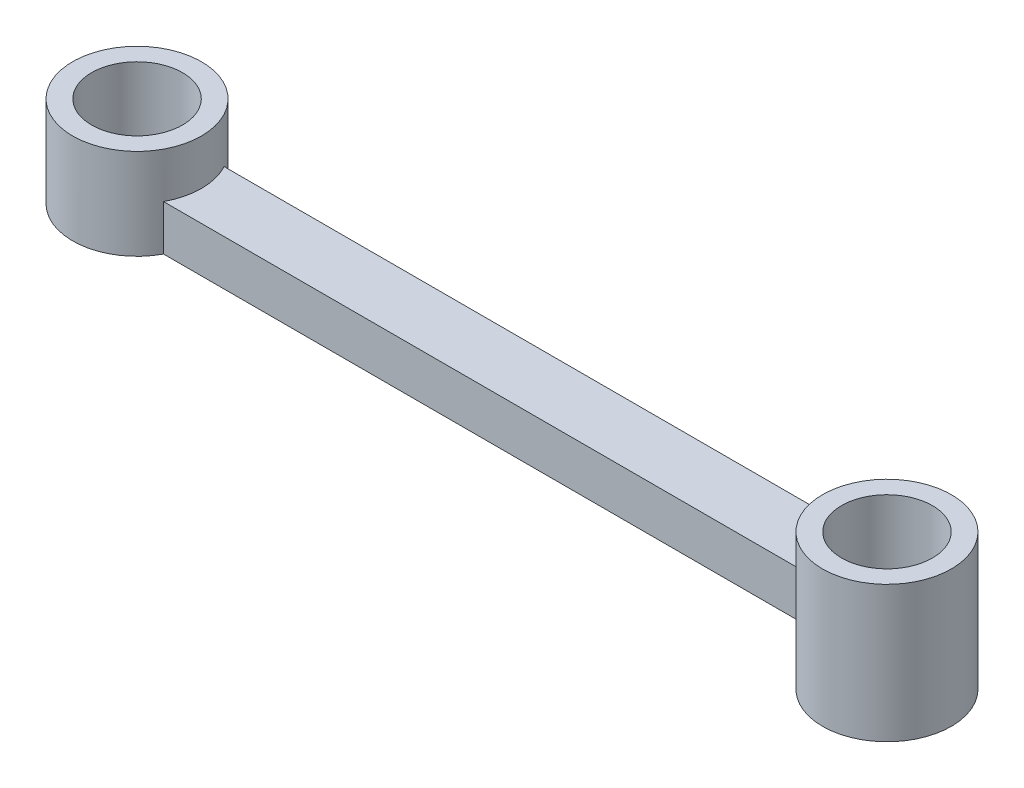
ISO-10303-21;
HEADER;
FILE_DESCRIPTION(('STEP AP214'),'2;1');
FILE_NAME('part.step','',(''),(''),'','','');
FILE_SCHEMA(('AUTOMOTIVE_DESIGN { 1 0 10303 214 1 1 1 1 }'));
ENDSEC;
DATA;
#1=APPLICATION_CONTEXT('core data for automotive mechanical design processes');
#2=APPLICATION_PROTOCOL_DEFINITION('international standard','automotive_design',2000,#1);
#3=PRODUCT_CONTEXT('',#1,'mechanical');
#4=PRODUCT('Part','Part','',(#3));
#5=PRODUCT_RELATED_PRODUCT_CATEGORY('part','',(#4));
#6=PRODUCT_DEFINITION_FORMATION('','',#4);
#7=PRODUCT_DEFINITION_CONTEXT('part definition',#1,'design');
#8=PRODUCT_DEFINITION('design','',#6,#7);
#9=PRODUCT_DEFINITION_SHAPE('','',#8);
#10=(LENGTH_UNIT() NAMED_UNIT(*) SI_UNIT(.MILLI.,.METRE.));
#11=(NAMED_UNIT(*) PLANE_ANGLE_UNIT() SI_UNIT($,.RADIAN.));
#12=(NAMED_UNIT(*) SI_UNIT($,.STERADIAN.) SOLID_ANGLE_UNIT());
#13=UNCERTAINTY_MEASURE_WITH_UNIT(LENGTH_MEASURE(1.E-05),#10,'distance_accuracy_value','');
#14=(GEOMETRIC_REPRESENTATION_CONTEXT(3) GLOBAL_UNCERTAINTY_ASSIGNED_CONTEXT((#13)) GLOBAL_UNIT_ASSIGNED_CONTEXT((#10,
#11,#12)) REPRESENTATION_CONTEXT('',''));
#15=CARTESIAN_POINT('',(0.,0.,0.));
#16=DIRECTION('',(0.,0.,1.));
#17=DIRECTION('',(1.,0.,0.));
#18=AXIS2_PLACEMENT_3D('',#15,#16,#17);
#19=CARTESIAN_POINT('',(0.,3.,1.99999999999999));
#20=DIRECTION('',(0.,0.,1.));
#21=DIRECTION('',(1.,0.,0.));
#22=AXIS2_PLACEMENT_3D('',#19,#20,#21);
#23=PLANE('',#22);
#24=DIRECTION('',(-1.,0.,0.));
#25=VECTOR('',#24,1.);
#26=CARTESIAN_POINT('',(0.,0.,1.99999999999999));
#27=LINE('',#26,#25);
#28=CARTESIAN_POINT('',(21.,0.,1.99999999999999));
#29=VERTEX_POINT('',#28);
#30=CARTESIAN_POINT('',(-21.,0.,2.));
#31=VERTEX_POINT('',#30);
#32=EDGE_CURVE('E98',#29,#31,#27,.T.);
#33=ORIENTED_EDGE('',*,*,#32,.F.);
#34=DIRECTION('',(0.,-1.,0.));
#35=VECTOR('',#34,1.);
#36=CARTESIAN_POINT('',(21.,3.,1.99999999999999));
#37=LINE('',#36,#35);
#38=CARTESIAN_POINT('',(21.,3.,1.99999999999999));
#39=VERTEX_POINT('',#38);
#40=EDGE_CURVE('E11',#39,#29,#37,.T.);
#41=ORIENTED_EDGE('',*,*,#40,.F.);
#42=DIRECTION('',(-1.,0.,0.));
#43=VECTOR('',#42,1.);
#44=CARTESIAN_POINT('',(0.,3.,1.99999999999999));
#45=LINE('',#44,#43);
#46=CARTESIAN_POINT('',(-21.,3.,1.99999999999999));
#47=VERTEX_POINT('',#46);
#48=EDGE_CURVE('E89',#39,#47,#45,.T.);
#49=ORIENTED_EDGE('',*,*,#48,.T.);
#50=DIRECTION('',(0.,-1.,0.));
#51=VECTOR('',#50,1.);
#52=CARTESIAN_POINT('',(-21.,3.,1.99999999999999));
#53=LINE('',#52,#51);
#54=EDGE_CURVE('E73',#47,#31,#53,.T.);
#55=ORIENTED_EDGE('',*,*,#54,.T.);
#56=EDGE_LOOP('',(#33,#41,#49,#55));
#57=FACE_BOUND('',#56,.T.);
#58=ADVANCED_FACE('F36',(#57),#23,.T.);
#59=CARTESIAN_POINT('',(0.,3.,-1.99999999999999));
#60=DIRECTION('',(0.,0.,1.));
#61=DIRECTION('',(1.,0.,0.));
#62=AXIS2_PLACEMENT_3D('',#59,#60,#61);
#63=PLANE('',#62);
#64=DIRECTION('',(-1.,0.,0.));
#65=VECTOR('',#64,1.);
#66=CARTESIAN_POINT('',(0.,0.,-1.99999999999999));
#67=LINE('',#66,#65);
#68=CARTESIAN_POINT('',(21.,0.,-1.99999999999999));
#69=VERTEX_POINT('',#68);
#70=CARTESIAN_POINT('',(-21.,0.,-1.99999999999999));
#71=VERTEX_POINT('',#70);
#72=EDGE_CURVE('E81',#69,#71,#67,.T.);
#73=ORIENTED_EDGE('',*,*,#72,.T.);
#74=DIRECTION('',(0.,-1.,0.));
#75=VECTOR('',#74,1.);
#76=CARTESIAN_POINT('',(-21.,3.,-1.99999999999999));
#77=LINE('',#76,#75);
#78=CARTESIAN_POINT('',(-21.,3.,-1.99999999999999));
#79=VERTEX_POINT('',#78);
#80=EDGE_CURVE('E95',#79,#71,#77,.T.);
#81=ORIENTED_EDGE('',*,*,#80,.F.);
#82=DIRECTION('',(-1.,0.,0.));
#83=VECTOR('',#82,1.);
#84=CARTESIAN_POINT('',(0.,3.,-1.99999999999999));
#85=LINE('',#84,#83);
#86=CARTESIAN_POINT('',(21.,3.,-1.99999999999999));
#87=VERTEX_POINT('',#86);
#88=EDGE_CURVE('E93',#87,#79,#85,.T.);
#89=ORIENTED_EDGE('',*,*,#88,.F.);
#90=DIRECTION('',(0.,-1.,0.));
#91=VECTOR('',#90,1.);
#92=CARTESIAN_POINT('',(21.,3.,-1.99999999999999));
#93=LINE('',#92,#91);
#94=EDGE_CURVE('E44',#87,#69,#93,.T.);
#95=ORIENTED_EDGE('',*,*,#94,.T.);
#96=EDGE_LOOP('',(#73,#81,#89,#95));
#97=FACE_BOUND('',#96,.T.);
#98=ADVANCED_FACE('F92',(#97),#63,.F.);
#99=CARTESIAN_POINT('',(0.,3.,0.));
#100=DIRECTION('',(0.,1.,0.));
#101=DIRECTION('',(0.,0.,1.));
#102=AXIS2_PLACEMENT_3D('',#99,#100,#101);
#103=PLANE('',#102);
#104=ORIENTED_EDGE('',*,*,#48,.F.);
#105=CARTESIAN_POINT('',(24.75,3.,0.));
#106=DIRECTION('',(0.,1.,0.));
#107=DIRECTION('',(0.,0.,1.));
#108=AXIS2_PLACEMENT_3D('',#105,#106,#107);
#109=CIRCLE('',#108,4.25);
#110=EDGE_CURVE('E52',#39,#87,#109,.F.);
#111=ORIENTED_EDGE('',*,*,#110,.T.);
#112=ORIENTED_EDGE('',*,*,#88,.T.);
#113=CARTESIAN_POINT('',(-24.75,3.,0.));
#114=DIRECTION('',(0.,1.,0.));
#115=DIRECTION('',(0.,0.,1.));
#116=AXIS2_PLACEMENT_3D('',#113,#114,#115);
#117=CIRCLE('',#116,4.25);
#118=EDGE_CURVE('E105',#47,#79,#117,.T.);
#119=ORIENTED_EDGE('',*,*,#118,.F.);
#120=EDGE_LOOP('',(#104,#111,#112,#119));
#121=FACE_BOUND('',#120,.T.);
#122=ADVANCED_FACE('F109',(#121),#103,.T.);
#123=CARTESIAN_POINT('',(0.,0.,0.));
#124=DIRECTION('',(0.,1.,0.));
#125=DIRECTION('',(0.,0.,1.));
#126=AXIS2_PLACEMENT_3D('',#123,#124,#125);
#127=PLANE('',#126);
#128=ORIENTED_EDGE('',*,*,#32,.T.);
#129=CARTESIAN_POINT('',(-24.75,0.,0.));
#130=DIRECTION('',(0.,1.,0.));
#131=DIRECTION('',(0.,0.,1.));
#132=AXIS2_PLACEMENT_3D('',#129,#130,#131);
#133=CIRCLE('',#132,4.25);
#134=EDGE_CURVE('E85',#71,#31,#133,.T.);
#135=ORIENTED_EDGE('',*,*,#134,.F.);
#136=ORIENTED_EDGE('',*,*,#72,.F.);
#137=CARTESIAN_POINT('',(24.75,0.,0.));
#138=DIRECTION('',(0.,1.,0.));
#139=DIRECTION('',(0.,0.,1.));
#140=AXIS2_PLACEMENT_3D('',#137,#138,#139);
#141=CIRCLE('',#140,4.25);
#142=EDGE_CURVE('E64',#29,#69,#141,.F.);
#143=ORIENTED_EDGE('',*,*,#142,.F.);
#144=EDGE_LOOP('',(#128,#135,#136,#143));
#145=FACE_BOUND('',#144,.T.);
#146=CARTESIAN_POINT('',(-24.75,0.,0.));
#147=DIRECTION('',(0.,1.,0.));
#148=DIRECTION('',(0.,0.,1.));
#149=AXIS2_PLACEMENT_3D('',#146,#147,#148);
#150=CIRCLE('',#149,3.);
#151=CARTESIAN_POINT('',(-24.75,0.,3.));
#152=VERTEX_POINT('',#151);
#153=EDGE_CURVE('E116',#152,#152,#150,.T.);
#154=ORIENTED_EDGE('',*,*,#153,.T.);
#155=EDGE_LOOP('',(#154));
#156=FACE_BOUND('',#155,.T.);
#157=ADVANCED_FACE('F83',(#145,#156),#127,.F.);
#158=CARTESIAN_POINT('',(-24.75,6.,0.));
#159=DIRECTION('',(0.,-1.,0.));
#160=DIRECTION('',(0.,0.,-1.));
#161=AXIS2_PLACEMENT_3D('',#158,#159,#160);
#162=CYLINDRICAL_SURFACE('',#161,3.);
#163=CARTESIAN_POINT('',(-24.75,6.,0.));
#164=DIRECTION('',(0.,1.,0.));
#165=DIRECTION('',(0.,0.,1.));
#166=AXIS2_PLACEMENT_3D('',#163,#164,#165);
#167=CIRCLE('',#166,3.);
#168=CARTESIAN_POINT('',(-24.75,6.,3.));
#169=VERTEX_POINT('',#168);
#170=EDGE_CURVE('E115',#169,#169,#167,.T.);
#171=ORIENTED_EDGE('',*,*,#170,.T.);
#172=EDGE_LOOP('',(#171));
#173=FACE_BOUND('',#172,.T.);
#174=ORIENTED_EDGE('',*,*,#153,.F.);
#175=EDGE_LOOP('',(#174));
#176=FACE_BOUND('',#175,.T.);
#177=ADVANCED_FACE('F167',(#173,#176),#162,.F.);
#178=CARTESIAN_POINT('',(-24.75,6.,0.));
#179=DIRECTION('',(0.,-1.,0.));
#180=DIRECTION('',(0.,0.,-1.));
#181=AXIS2_PLACEMENT_3D('',#178,#179,#180);
#182=CYLINDRICAL_SURFACE('',#181,4.25);
#183=ORIENTED_EDGE('',*,*,#54,.F.);
#184=ORIENTED_EDGE('',*,*,#118,.T.);
#185=ORIENTED_EDGE('',*,*,#80,.T.);
#186=ORIENTED_EDGE('',*,*,#134,.T.);
#187=EDGE_LOOP('',(#183,#184,#185,#186));
#188=FACE_BOUND('',#187,.T.);
#189=CARTESIAN_POINT('',(-24.75,6.,0.));
#190=DIRECTION('',(0.,1.,0.));
#191=DIRECTION('',(0.,0.,1.));
#192=AXIS2_PLACEMENT_3D('',#189,#190,#191);
#193=CIRCLE('',#192,4.25);
#194=CARTESIAN_POINT('',(-24.75,6.,4.25));
#195=VERTEX_POINT('',#194);
#196=EDGE_CURVE('E100',#195,#195,#193,.T.);
#197=ORIENTED_EDGE('',*,*,#196,.F.);
#198=EDGE_LOOP('',(#197));
#199=FACE_BOUND('',#198,.T.);
#200=ADVANCED_FACE('F106',(#188,#199),#182,.T.);
#201=CARTESIAN_POINT('',(0.,6.,0.));
#202=DIRECTION('',(0.,1.,0.));
#203=DIRECTION('',(0.,0.,1.));
#204=AXIS2_PLACEMENT_3D('',#201,#202,#203);
#205=PLANE('',#204);
#206=ORIENTED_EDGE('',*,*,#170,.F.);
#207=EDGE_LOOP('',(#206));
#208=FACE_BOUND('',#207,.T.);
#209=ORIENTED_EDGE('',*,*,#196,.T.);
#210=EDGE_LOOP('',(#209));
#211=FACE_BOUND('',#210,.T.);
#212=ADVANCED_FACE('F154',(#208,#211),#205,.T.);
#213=CARTESIAN_POINT('',(24.75,-3.,0.));
#214=DIRECTION('',(0.,1.,0.));
#215=DIRECTION('',(0.,0.,1.));
#216=AXIS2_PLACEMENT_3D('',#213,#214,#215);
#217=CYLINDRICAL_SURFACE('',#216,4.25);
#218=ORIENTED_EDGE('',*,*,#110,.F.);
#219=ORIENTED_EDGE('',*,*,#40,.T.);
#220=ORIENTED_EDGE('',*,*,#142,.T.);
#221=ORIENTED_EDGE('',*,*,#94,.F.);
#222=EDGE_LOOP('',(#218,#219,#220,#221));
#223=FACE_BOUND('',#222,.T.);
#224=CARTESIAN_POINT('',(24.75,-3.,0.));
#225=DIRECTION('',(0.,1.,0.));
#226=DIRECTION('',(0.,0.,1.));
#227=AXIS2_PLACEMENT_3D('',#224,#225,#226);
#228=CIRCLE('',#227,4.25);
#229=CARTESIAN_POINT('',(24.75,-3.,4.24999999999999));
#230=VERTEX_POINT('',#229);
#231=EDGE_CURVE('E126',#230,#230,#228,.F.);
#232=ORIENTED_EDGE('',*,*,#231,.F.);
#233=EDGE_LOOP('',(#232));
#234=FACE_BOUND('',#233,.T.);
#235=CARTESIAN_POINT('',(24.75,6.,0.));
#236=DIRECTION('',(0.,1.,0.));
#237=DIRECTION('',(0.,0.,1.));
#238=AXIS2_PLACEMENT_3D('',#235,#236,#237);
#239=CIRCLE('',#238,4.25);
#240=CARTESIAN_POINT('',(24.75,6.,4.24999999999999));
#241=VERTEX_POINT('',#240);
#242=EDGE_CURVE('E132',#241,#241,#239,.F.);
#243=ORIENTED_EDGE('',*,*,#242,.T.);
#244=EDGE_LOOP('',(#243));
#245=FACE_BOUND('',#244,.T.);
#246=ADVANCED_FACE('F96',(#223,#234,#245),#217,.T.);
#247=CARTESIAN_POINT('',(24.75,-3.,0.));
#248=DIRECTION('',(0.,1.,0.));
#249=DIRECTION('',(0.,0.,1.));
#250=AXIS2_PLACEMENT_3D('',#247,#248,#249);
#251=CYLINDRICAL_SURFACE('',#250,3.);
#252=CARTESIAN_POINT('',(24.75,-3.,0.));
#253=DIRECTION('',(0.,1.,0.));
#254=DIRECTION('',(0.,0.,1.));
#255=AXIS2_PLACEMENT_3D('',#252,#253,#254);
#256=CIRCLE('',#255,3.);
#257=CARTESIAN_POINT('',(24.75,-3.,3.));
#258=VERTEX_POINT('',#257);
#259=EDGE_CURVE('E119',#258,#258,#256,.F.);
#260=ORIENTED_EDGE('',*,*,#259,.T.);
#261=EDGE_LOOP('',(#260));
#262=FACE_BOUND('',#261,.T.);
#263=CARTESIAN_POINT('',(24.75,6.,0.));
#264=DIRECTION('',(0.,1.,0.));
#265=DIRECTION('',(0.,0.,1.));
#266=AXIS2_PLACEMENT_3D('',#263,#264,#265);
#267=CIRCLE('',#266,3.);
#268=CARTESIAN_POINT('',(24.75,6.,3.));
#269=VERTEX_POINT('',#268);
#270=EDGE_CURVE('E129',#269,#269,#267,.F.);
#271=ORIENTED_EDGE('',*,*,#270,.F.);
#272=EDGE_LOOP('',(#271));
#273=FACE_BOUND('',#272,.T.);
#274=ADVANCED_FACE('F144',(#262,#273),#251,.F.);
#275=CARTESIAN_POINT('',(0.,-3.,0.));
#276=DIRECTION('',(0.,1.,0.));
#277=DIRECTION('',(0.,0.,1.));
#278=AXIS2_PLACEMENT_3D('',#275,#276,#277);
#279=PLANE('',#278);
#280=ORIENTED_EDGE('',*,*,#231,.T.);
#281=EDGE_LOOP('',(#280));
#282=FACE_BOUND('',#281,.T.);
#283=ORIENTED_EDGE('',*,*,#259,.F.);
#284=EDGE_LOOP('',(#283));
#285=FACE_BOUND('',#284,.T.);
#286=ADVANCED_FACE('F140',(#282,#285),#279,.F.);
#287=CARTESIAN_POINT('',(0.,6.,0.));
#288=DIRECTION('',(0.,1.,0.));
#289=DIRECTION('',(0.,0.,1.));
#290=AXIS2_PLACEMENT_3D('',#287,#288,#289);
#291=PLANE('',#290);
#292=ORIENTED_EDGE('',*,*,#242,.F.);
#293=EDGE_LOOP('',(#292));
#294=FACE_BOUND('',#293,.T.);
#295=ORIENTED_EDGE('',*,*,#270,.T.);
#296=EDGE_LOOP('',(#295));
#297=FACE_BOUND('',#296,.T.);
#298=ADVANCED_FACE('F137',(#294,#297),#291,.T.);
#299=CLOSED_SHELL('',(#58,#98,#122,#157,#177,#200,#212,#246,#274,#286,#298));
#300=MANIFOLD_SOLID_BREP('B2',#299);
#301=ADVANCED_BREP_SHAPE_REPRESENTATION('',(#18,#300),#14);
#302=SHAPE_DEFINITION_REPRESENTATION(#9,#301);
ENDSEC;
END-ISO-10303-21;
